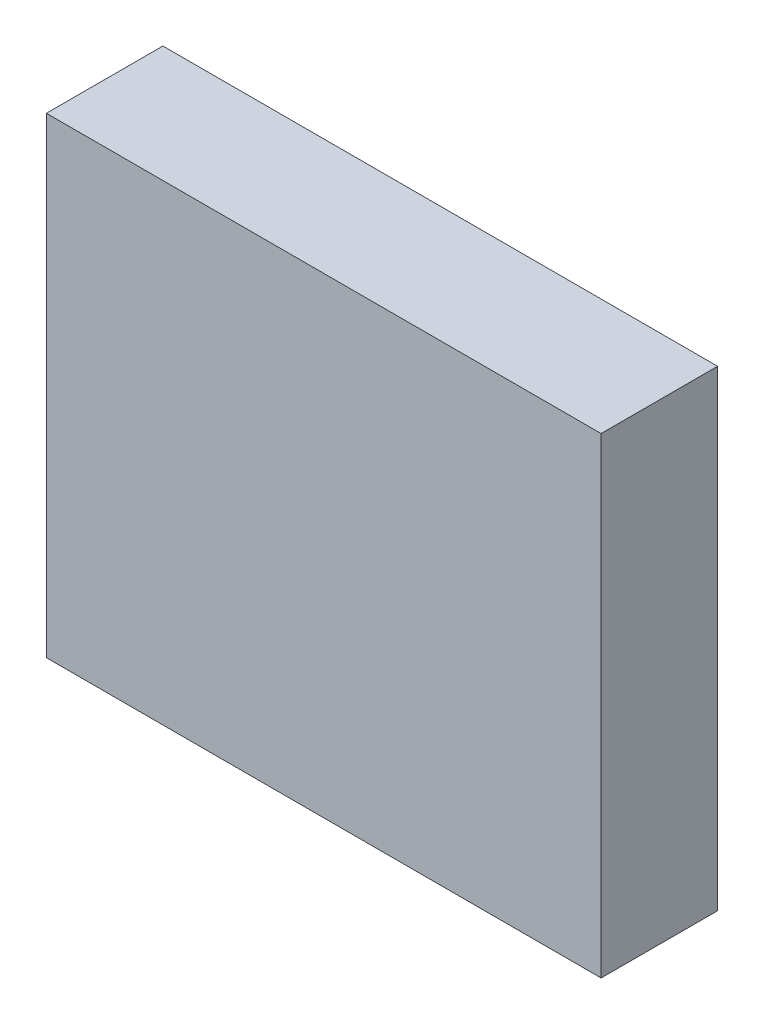
ISO-10303-21;
HEADER;
FILE_DESCRIPTION(('STEP AP214'),'2;1');
FILE_NAME('part.step','',(''),(''),'','','');
FILE_SCHEMA(('AUTOMOTIVE_DESIGN { 1 0 10303 214 1 1 1 1 }'));
ENDSEC;
DATA;
#1=APPLICATION_CONTEXT('core data for automotive mechanical design processes');
#2=APPLICATION_PROTOCOL_DEFINITION('international standard','automotive_design',2000,#1);
#3=PRODUCT_CONTEXT('',#1,'mechanical');
#4=PRODUCT('Part','Part','',(#3));
#5=PRODUCT_RELATED_PRODUCT_CATEGORY('part','',(#4));
#6=PRODUCT_DEFINITION_FORMATION('','',#4);
#7=PRODUCT_DEFINITION_CONTEXT('part definition',#1,'design');
#8=PRODUCT_DEFINITION('design','',#6,#7);
#9=PRODUCT_DEFINITION_SHAPE('','',#8);
#10=(LENGTH_UNIT() NAMED_UNIT(*) SI_UNIT(.MILLI.,.METRE.));
#11=(NAMED_UNIT(*) PLANE_ANGLE_UNIT() SI_UNIT($,.RADIAN.));
#12=(NAMED_UNIT(*) SI_UNIT($,.STERADIAN.) SOLID_ANGLE_UNIT());
#13=UNCERTAINTY_MEASURE_WITH_UNIT(LENGTH_MEASURE(1.E-05),#10,'distance_accuracy_value','');
#14=(GEOMETRIC_REPRESENTATION_CONTEXT(3) GLOBAL_UNCERTAINTY_ASSIGNED_CONTEXT((#13)) GLOBAL_UNIT_ASSIGNED_CONTEXT((#10,
#11,#12)) REPRESENTATION_CONTEXT('',''));
#15=CARTESIAN_POINT('',(0.,0.,0.));
#16=DIRECTION('',(0.,0.,1.));
#17=DIRECTION('',(1.,0.,0.));
#18=AXIS2_PLACEMENT_3D('',#15,#16,#17);
#19=CARTESIAN_POINT('',(0.,0.,5.334));
#20=DIRECTION('',(1.,0.,0.));
#21=DIRECTION('',(0.,1.,0.));
#22=AXIS2_PLACEMENT_3D('',#19,#20,#21);
#23=PLANE('',#22);
#24=DIRECTION('',(0.,-1.,0.));
#25=VECTOR('',#24,1.);
#26=CARTESIAN_POINT('',(0.,0.,0.));
#27=LINE('',#26,#25);
#28=CARTESIAN_POINT('',(0.,0.,0.));
#29=VERTEX_POINT('',#28);
#30=CARTESIAN_POINT('',(0.,-21.59,0.));
#31=VERTEX_POINT('',#30);
#32=EDGE_CURVE('E98',#29,#31,#27,.T.);
#33=ORIENTED_EDGE('',*,*,#32,.T.);
#34=DIRECTION('',(0.,0.,-1.));
#35=VECTOR('',#34,1.);
#36=CARTESIAN_POINT('',(0.,-21.59,5.334));
#37=LINE('',#36,#35);
#38=CARTESIAN_POINT('',(0.,-21.59,5.334));
#39=VERTEX_POINT('',#38);
#40=EDGE_CURVE('E11',#39,#31,#37,.T.);
#41=ORIENTED_EDGE('',*,*,#40,.F.);
#42=DIRECTION('',(0.,-1.,0.));
#43=VECTOR('',#42,1.);
#44=CARTESIAN_POINT('',(0.,0.,5.334));
#45=LINE('',#44,#43);
#46=CARTESIAN_POINT('',(0.,0.,5.334));
#47=VERTEX_POINT('',#46);
#48=EDGE_CURVE('E86',#47,#39,#45,.T.);
#49=ORIENTED_EDGE('',*,*,#48,.F.);
#50=DIRECTION('',(0.,0.,-1.));
#51=VECTOR('',#50,1.);
#52=CARTESIAN_POINT('',(0.,0.,5.334));
#53=LINE('',#52,#51);
#54=EDGE_CURVE('E94',#47,#29,#53,.T.);
#55=ORIENTED_EDGE('',*,*,#54,.T.);
#56=EDGE_LOOP('',(#33,#41,#49,#55));
#57=FACE_BOUND('',#56,.T.);
#58=ADVANCED_FACE('F35',(#57),#23,.F.);
#59=CARTESIAN_POINT('',(0.,-21.59,5.334));
#60=DIRECTION('',(0.,1.,0.));
#61=DIRECTION('',(0.,0.,1.));
#62=AXIS2_PLACEMENT_3D('',#59,#60,#61);
#63=PLANE('',#62);
#64=DIRECTION('',(1.,0.,0.));
#65=VECTOR('',#64,1.);
#66=CARTESIAN_POINT('',(0.,-21.59,0.));
#67=LINE('',#66,#65);
#68=CARTESIAN_POINT('',(25.4,-21.59,0.));
#69=VERTEX_POINT('',#68);
#70=EDGE_CURVE('E90',#31,#69,#67,.T.);
#71=ORIENTED_EDGE('',*,*,#70,.T.);
#72=DIRECTION('',(0.,0.,-1.));
#73=VECTOR('',#72,1.);
#74=CARTESIAN_POINT('',(25.4,-21.59,5.334));
#75=LINE('',#74,#73);
#76=CARTESIAN_POINT('',(25.4,-21.59,5.334));
#77=VERTEX_POINT('',#76);
#78=EDGE_CURVE('E43',#77,#69,#75,.T.);
#79=ORIENTED_EDGE('',*,*,#78,.F.);
#80=DIRECTION('',(1.,0.,0.));
#81=VECTOR('',#80,1.);
#82=CARTESIAN_POINT('',(0.,-21.59,5.334));
#83=LINE('',#82,#81);
#84=EDGE_CURVE('E81',#39,#77,#83,.T.);
#85=ORIENTED_EDGE('',*,*,#84,.F.);
#86=ORIENTED_EDGE('',*,*,#40,.T.);
#87=EDGE_LOOP('',(#71,#79,#85,#86));
#88=FACE_BOUND('',#87,.T.);
#89=ADVANCED_FACE('F89',(#88),#63,.F.);
#90=CARTESIAN_POINT('',(25.4,0.,5.334));
#91=DIRECTION('',(-1.,0.,0.));
#92=DIRECTION('',(0.,-1.,0.));
#93=AXIS2_PLACEMENT_3D('',#90,#91,#92);
#94=PLANE('',#93);
#95=DIRECTION('',(0.,1.,0.));
#96=VECTOR('',#95,1.);
#97=CARTESIAN_POINT('',(25.4,0.,0.));
#98=LINE('',#97,#96);
#99=CARTESIAN_POINT('',(25.4,0.,0.));
#100=VERTEX_POINT('',#99);
#101=EDGE_CURVE('E68',#69,#100,#98,.T.);
#102=ORIENTED_EDGE('',*,*,#101,.T.);
#103=DIRECTION('',(0.,0.,-1.));
#104=VECTOR('',#103,1.);
#105=CARTESIAN_POINT('',(25.4,0.,5.334));
#106=LINE('',#105,#104);
#107=CARTESIAN_POINT('',(25.4,0.,5.334));
#108=VERTEX_POINT('',#107);
#109=EDGE_CURVE('E91',#108,#100,#106,.T.);
#110=ORIENTED_EDGE('',*,*,#109,.F.);
#111=DIRECTION('',(0.,1.,0.));
#112=VECTOR('',#111,1.);
#113=CARTESIAN_POINT('',(25.4,0.,5.334));
#114=LINE('',#113,#112);
#115=EDGE_CURVE('E84',#77,#108,#114,.T.);
#116=ORIENTED_EDGE('',*,*,#115,.F.);
#117=ORIENTED_EDGE('',*,*,#78,.T.);
#118=EDGE_LOOP('',(#102,#110,#116,#117));
#119=FACE_BOUND('',#118,.T.);
#120=ADVANCED_FACE('F92',(#119),#94,.F.);
#121=CARTESIAN_POINT('',(0.,0.,5.334));
#122=DIRECTION('',(0.,-1.,0.));
#123=DIRECTION('',(0.,0.,-1.));
#124=AXIS2_PLACEMENT_3D('',#121,#122,#123);
#125=PLANE('',#124);
#126=DIRECTION('',(-1.,0.,0.));
#127=VECTOR('',#126,1.);
#128=CARTESIAN_POINT('',(0.,0.,0.));
#129=LINE('',#128,#127);
#130=EDGE_CURVE('E74',#100,#29,#129,.T.);
#131=ORIENTED_EDGE('',*,*,#130,.T.);
#132=ORIENTED_EDGE('',*,*,#54,.F.);
#133=DIRECTION('',(-1.,0.,0.));
#134=VECTOR('',#133,1.);
#135=CARTESIAN_POINT('',(0.,0.,5.334));
#136=LINE('',#135,#134);
#137=EDGE_CURVE('E51',#108,#47,#136,.T.);
#138=ORIENTED_EDGE('',*,*,#137,.F.);
#139=ORIENTED_EDGE('',*,*,#109,.T.);
#140=EDGE_LOOP('',(#131,#132,#138,#139));
#141=FACE_BOUND('',#140,.T.);
#142=ADVANCED_FACE('F105',(#141),#125,.F.);
#143=CARTESIAN_POINT('',(0.,0.,5.334));
#144=DIRECTION('',(0.,0.,1.));
#145=DIRECTION('',(1.,0.,0.));
#146=AXIS2_PLACEMENT_3D('',#143,#144,#145);
#147=PLANE('',#146);
#148=ORIENTED_EDGE('',*,*,#48,.T.);
#149=ORIENTED_EDGE('',*,*,#84,.T.);
#150=ORIENTED_EDGE('',*,*,#115,.T.);
#151=ORIENTED_EDGE('',*,*,#137,.T.);
#152=EDGE_LOOP('',(#148,#149,#150,#151));
#153=FACE_BOUND('',#152,.T.);
#154=ADVANCED_FACE('F82',(#153),#147,.T.);
#155=CARTESIAN_POINT('',(0.,0.,0.));
#156=DIRECTION('',(0.,0.,1.));
#157=DIRECTION('',(1.,0.,0.));
#158=AXIS2_PLACEMENT_3D('',#155,#156,#157);
#159=PLANE('',#158);
#160=ORIENTED_EDGE('',*,*,#32,.F.);
#161=ORIENTED_EDGE('',*,*,#130,.F.);
#162=ORIENTED_EDGE('',*,*,#101,.F.);
#163=ORIENTED_EDGE('',*,*,#70,.F.);
#164=EDGE_LOOP('',(#160,#161,#162,#163));
#165=FACE_BOUND('',#164,.T.);
#166=ADVANCED_FACE('F108',(#165),#159,.F.);
#167=CLOSED_SHELL('',(#58,#89,#120,#142,#154,#166));
#168=MANIFOLD_SOLID_BREP('B2',#167);
#169=ADVANCED_BREP_SHAPE_REPRESENTATION('',(#18,#168),#14);
#170=SHAPE_DEFINITION_REPRESENTATION(#9,#169);
ENDSEC;
END-ISO-10303-21;
